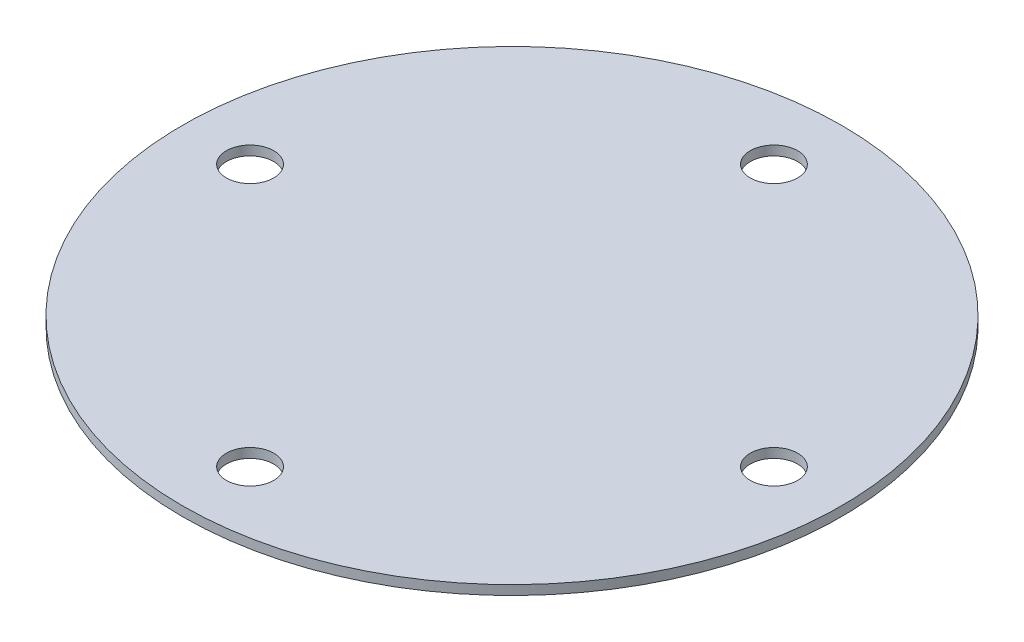
ISO-10303-21;
HEADER;
FILE_DESCRIPTION(('STEP AP214'),'2;1');
FILE_NAME('part.step','',(''),(''),'','','');
FILE_SCHEMA(('AUTOMOTIVE_DESIGN { 1 0 10303 214 1 1 1 1 }'));
ENDSEC;
DATA;
#1=APPLICATION_CONTEXT('core data for automotive mechanical design processes');
#2=APPLICATION_PROTOCOL_DEFINITION('international standard','automotive_design',2000,#1);
#3=PRODUCT_CONTEXT('',#1,'mechanical');
#4=PRODUCT('Part','Part','',(#3));
#5=PRODUCT_RELATED_PRODUCT_CATEGORY('part','',(#4));
#6=PRODUCT_DEFINITION_FORMATION('','',#4);
#7=PRODUCT_DEFINITION_CONTEXT('part definition',#1,'design');
#8=PRODUCT_DEFINITION('design','',#6,#7);
#9=PRODUCT_DEFINITION_SHAPE('','',#8);
#10=(LENGTH_UNIT() NAMED_UNIT(*) SI_UNIT(.MILLI.,.METRE.));
#11=(NAMED_UNIT(*) PLANE_ANGLE_UNIT() SI_UNIT($,.RADIAN.));
#12=(NAMED_UNIT(*) SI_UNIT($,.STERADIAN.) SOLID_ANGLE_UNIT());
#13=UNCERTAINTY_MEASURE_WITH_UNIT(LENGTH_MEASURE(1.E-05),#10,'distance_accuracy_value','');
#14=(GEOMETRIC_REPRESENTATION_CONTEXT(3) GLOBAL_UNCERTAINTY_ASSIGNED_CONTEXT((#13)) GLOBAL_UNIT_ASSIGNED_CONTEXT((#10,
#11,#12)) REPRESENTATION_CONTEXT('',''));
#15=CARTESIAN_POINT('',(0.,0.,0.));
#16=DIRECTION('',(0.,0.,1.));
#17=DIRECTION('',(1.,0.,0.));
#18=AXIS2_PLACEMENT_3D('',#15,#16,#17);
#19=CARTESIAN_POINT('',(0.,2.54,0.));
#20=DIRECTION('',(0.,-1.,0.));
#21=DIRECTION('',(0.,0.,-1.));
#22=AXIS2_PLACEMENT_3D('',#19,#20,#21);
#23=CYLINDRICAL_SURFACE('',#22,88.519);
#24=CARTESIAN_POINT('',(0.,2.54,0.));
#25=DIRECTION('',(0.,1.,0.));
#26=DIRECTION('',(0.,0.,1.));
#27=AXIS2_PLACEMENT_3D('',#24,#25,#26);
#28=CIRCLE('',#27,88.519);
#29=CARTESIAN_POINT('',(0.,2.54,88.519));
#30=VERTEX_POINT('',#29);
#31=EDGE_CURVE('E10',#30,#30,#28,.T.);
#32=ORIENTED_EDGE('',*,*,#31,.F.);
#33=EDGE_LOOP('',(#32));
#34=FACE_BOUND('',#33,.T.);
#35=CARTESIAN_POINT('',(0.,0.,0.));
#36=DIRECTION('',(0.,1.,0.));
#37=DIRECTION('',(0.,0.,1.));
#38=AXIS2_PLACEMENT_3D('',#35,#36,#37);
#39=CIRCLE('',#38,88.519);
#40=CARTESIAN_POINT('',(0.,0.,88.519));
#41=VERTEX_POINT('',#40);
#42=EDGE_CURVE('E45',#41,#41,#39,.T.);
#43=ORIENTED_EDGE('',*,*,#42,.T.);
#44=EDGE_LOOP('',(#43));
#45=FACE_BOUND('',#44,.T.);
#46=ADVANCED_FACE('F42',(#34,#45),#23,.T.);
#47=CARTESIAN_POINT('',(0.,2.54,0.));
#48=DIRECTION('',(0.,1.,0.));
#49=DIRECTION('',(0.,0.,1.));
#50=AXIS2_PLACEMENT_3D('',#47,#48,#49);
#51=PLANE('',#50);
#52=CARTESIAN_POINT('',(0.,2.54,-70.358));
#53=DIRECTION('',(0.,1.,0.));
#54=DIRECTION('',(0.,0.,1.));
#55=AXIS2_PLACEMENT_3D('',#52,#53,#54);
#56=CIRCLE('',#55,6.35);
#57=CARTESIAN_POINT('',(0.,2.54,-64.008));
#58=VERTEX_POINT('',#57);
#59=EDGE_CURVE('E80',#58,#58,#56,.T.);
#60=ORIENTED_EDGE('',*,*,#59,.F.);
#61=EDGE_LOOP('',(#60));
#62=FACE_BOUND('',#61,.T.);
#63=CARTESIAN_POINT('',(70.358,2.54,2.45653644038325E-13));
#64=DIRECTION('',(0.,1.,0.));
#65=DIRECTION('',(0.,0.,1.));
#66=AXIS2_PLACEMENT_3D('',#63,#64,#65);
#67=CIRCLE('',#66,6.35);
#68=CARTESIAN_POINT('',(70.358,2.54,6.35000000000024));
#69=VERTEX_POINT('',#68);
#70=EDGE_CURVE('E76',#69,#69,#67,.T.);
#71=ORIENTED_EDGE('',*,*,#70,.F.);
#72=EDGE_LOOP('',(#71));
#73=FACE_BOUND('',#72,.T.);
#74=CARTESIAN_POINT('',(-4.9130728807665E-13,2.54,70.358));
#75=DIRECTION('',(0.,1.,0.));
#76=DIRECTION('',(0.,0.,1.));
#77=AXIS2_PLACEMENT_3D('',#74,#75,#76);
#78=CIRCLE('',#77,6.35);
#79=CARTESIAN_POINT('',(-4.9130728807665E-13,2.54,76.708));
#80=VERTEX_POINT('',#79);
#81=EDGE_CURVE('E68',#80,#80,#78,.T.);
#82=ORIENTED_EDGE('',*,*,#81,.F.);
#83=EDGE_LOOP('',(#82));
#84=FACE_BOUND('',#83,.T.);
#85=CARTESIAN_POINT('',(-70.358,2.54,-7.36960932114976E-13));
#86=DIRECTION('',(0.,1.,0.));
#87=DIRECTION('',(0.,0.,1.));
#88=AXIS2_PLACEMENT_3D('',#85,#86,#87);
#89=CIRCLE('',#88,6.35);
#90=CARTESIAN_POINT('',(-70.358,2.54,6.34999999999926));
#91=VERTEX_POINT('',#90);
#92=EDGE_CURVE('E60',#91,#91,#89,.T.);
#93=ORIENTED_EDGE('',*,*,#92,.F.);
#94=EDGE_LOOP('',(#93));
#95=FACE_BOUND('',#94,.T.);
#96=ORIENTED_EDGE('',*,*,#31,.T.);
#97=EDGE_LOOP('',(#96));
#98=FACE_BOUND('',#97,.T.);
#99=ADVANCED_FACE('F98',(#62,#73,#84,#95,#98),#51,.T.);
#100=CARTESIAN_POINT('',(0.,0.,0.));
#101=DIRECTION('',(0.,1.,0.));
#102=DIRECTION('',(0.,0.,1.));
#103=AXIS2_PLACEMENT_3D('',#100,#101,#102);
#104=PLANE('',#103);
#105=CARTESIAN_POINT('',(0.,0.,-70.358));
#106=DIRECTION('',(0.,1.,0.));
#107=DIRECTION('',(0.,0.,1.));
#108=AXIS2_PLACEMENT_3D('',#105,#106,#107);
#109=CIRCLE('',#108,6.35);
#110=CARTESIAN_POINT('',(0.,0.,-64.008));
#111=VERTEX_POINT('',#110);
#112=EDGE_CURVE('E54',#111,#111,#109,.T.);
#113=ORIENTED_EDGE('',*,*,#112,.T.);
#114=EDGE_LOOP('',(#113));
#115=FACE_BOUND('',#114,.T.);
#116=CARTESIAN_POINT('',(70.358,0.,2.45653644038325E-13));
#117=DIRECTION('',(0.,1.,0.));
#118=DIRECTION('',(0.,0.,1.));
#119=AXIS2_PLACEMENT_3D('',#116,#117,#118);
#120=CIRCLE('',#119,6.35);
#121=CARTESIAN_POINT('',(70.358,0.,6.35000000000024));
#122=VERTEX_POINT('',#121);
#123=EDGE_CURVE('E72',#122,#122,#120,.T.);
#124=ORIENTED_EDGE('',*,*,#123,.T.);
#125=EDGE_LOOP('',(#124));
#126=FACE_BOUND('',#125,.T.);
#127=CARTESIAN_POINT('',(-4.9130728807665E-13,0.,70.358));
#128=DIRECTION('',(0.,1.,0.));
#129=DIRECTION('',(0.,0.,1.));
#130=AXIS2_PLACEMENT_3D('',#127,#128,#129);
#131=CIRCLE('',#130,6.35);
#132=CARTESIAN_POINT('',(-4.9130728807665E-13,0.,76.708));
#133=VERTEX_POINT('',#132);
#134=EDGE_CURVE('E64',#133,#133,#131,.T.);
#135=ORIENTED_EDGE('',*,*,#134,.T.);
#136=EDGE_LOOP('',(#135));
#137=FACE_BOUND('',#136,.T.);
#138=CARTESIAN_POINT('',(-70.358,0.,-7.36960932114976E-13));
#139=DIRECTION('',(0.,1.,0.));
#140=DIRECTION('',(0.,0.,1.));
#141=AXIS2_PLACEMENT_3D('',#138,#139,#140);
#142=CIRCLE('',#141,6.35);
#143=CARTESIAN_POINT('',(-70.358,0.,6.34999999999926));
#144=VERTEX_POINT('',#143);
#145=EDGE_CURVE('E56',#144,#144,#142,.T.);
#146=ORIENTED_EDGE('',*,*,#145,.T.);
#147=EDGE_LOOP('',(#146));
#148=FACE_BOUND('',#147,.T.);
#149=ORIENTED_EDGE('',*,*,#42,.F.);
#150=EDGE_LOOP('',(#149));
#151=FACE_BOUND('',#150,.T.);
#152=ADVANCED_FACE('F88',(#115,#126,#137,#148,#151),#104,.F.);
#153=CARTESIAN_POINT('',(-70.358,0.,-7.36960932114976E-13));
#154=DIRECTION('',(0.,1.,0.));
#155=DIRECTION('',(0.,0.,1.));
#156=AXIS2_PLACEMENT_3D('',#153,#154,#155);
#157=CYLINDRICAL_SURFACE('',#156,6.35);
#158=ORIENTED_EDGE('',*,*,#145,.F.);
#159=EDGE_LOOP('',(#158));
#160=FACE_BOUND('',#159,.T.);
#161=ORIENTED_EDGE('',*,*,#92,.T.);
#162=EDGE_LOOP('',(#161));
#163=FACE_BOUND('',#162,.T.);
#164=ADVANCED_FACE('F108',(#160,#163),#157,.F.);
#165=CARTESIAN_POINT('',(-4.9130728807665E-13,0.,70.358));
#166=DIRECTION('',(0.,1.,0.));
#167=DIRECTION('',(0.,0.,1.));
#168=AXIS2_PLACEMENT_3D('',#165,#166,#167);
#169=CYLINDRICAL_SURFACE('',#168,6.35);
#170=ORIENTED_EDGE('',*,*,#134,.F.);
#171=EDGE_LOOP('',(#170));
#172=FACE_BOUND('',#171,.T.);
#173=ORIENTED_EDGE('',*,*,#81,.T.);
#174=EDGE_LOOP('',(#173));
#175=FACE_BOUND('',#174,.T.);
#176=ADVANCED_FACE('F110',(#172,#175),#169,.F.);
#177=CARTESIAN_POINT('',(70.358,0.,2.45653644038325E-13));
#178=DIRECTION('',(0.,1.,0.));
#179=DIRECTION('',(0.,0.,1.));
#180=AXIS2_PLACEMENT_3D('',#177,#178,#179);
#181=CYLINDRICAL_SURFACE('',#180,6.35);
#182=ORIENTED_EDGE('',*,*,#123,.F.);
#183=EDGE_LOOP('',(#182));
#184=FACE_BOUND('',#183,.T.);
#185=ORIENTED_EDGE('',*,*,#70,.T.);
#186=EDGE_LOOP('',(#185));
#187=FACE_BOUND('',#186,.T.);
#188=ADVANCED_FACE('F94',(#184,#187),#181,.F.);
#189=CARTESIAN_POINT('',(0.,0.,-70.358));
#190=DIRECTION('',(0.,1.,0.));
#191=DIRECTION('',(0.,0.,1.));
#192=AXIS2_PLACEMENT_3D('',#189,#190,#191);
#193=CYLINDRICAL_SURFACE('',#192,6.35);
#194=ORIENTED_EDGE('',*,*,#112,.F.);
#195=EDGE_LOOP('',(#194));
#196=FACE_BOUND('',#195,.T.);
#197=ORIENTED_EDGE('',*,*,#59,.T.);
#198=EDGE_LOOP('',(#197));
#199=FACE_BOUND('',#198,.T.);
#200=ADVANCED_FACE('F91',(#196,#199),#193,.F.);
#201=CLOSED_SHELL('',(#46,#99,#152,#164,#176,#188,#200));
#202=MANIFOLD_SOLID_BREP('B2',#201);
#203=ADVANCED_BREP_SHAPE_REPRESENTATION('',(#18,#202),#14);
#204=SHAPE_DEFINITION_REPRESENTATION(#9,#203);
ENDSEC;
END-ISO-10303-21;
